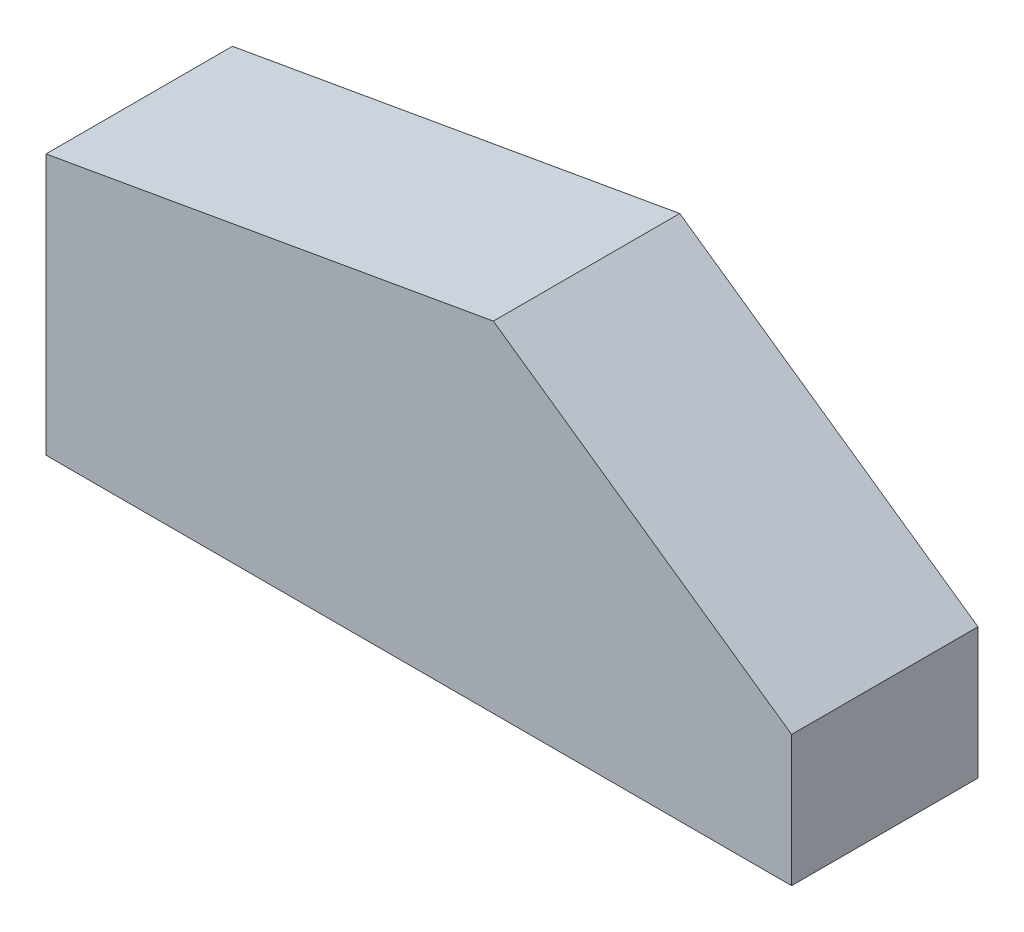
ISO-10303-21;
HEADER;
FILE_DESCRIPTION(('STEP AP214'),'2;1');
FILE_NAME('part.step','',(''),(''),'','','');
FILE_SCHEMA(('AUTOMOTIVE_DESIGN { 1 0 10303 214 1 1 1 1 }'));
ENDSEC;
DATA;
#1=APPLICATION_CONTEXT('core data for automotive mechanical design processes');
#2=APPLICATION_PROTOCOL_DEFINITION('international standard','automotive_design',2000,#1);
#3=PRODUCT_CONTEXT('',#1,'mechanical');
#4=PRODUCT('Part','Part','',(#3));
#5=PRODUCT_RELATED_PRODUCT_CATEGORY('part','',(#4));
#6=PRODUCT_DEFINITION_FORMATION('','',#4);
#7=PRODUCT_DEFINITION_CONTEXT('part definition',#1,'design');
#8=PRODUCT_DEFINITION('design','',#6,#7);
#9=PRODUCT_DEFINITION_SHAPE('','',#8);
#10=(LENGTH_UNIT() NAMED_UNIT(*) SI_UNIT(.MILLI.,.METRE.));
#11=(NAMED_UNIT(*) PLANE_ANGLE_UNIT() SI_UNIT($,.RADIAN.));
#12=(NAMED_UNIT(*) SI_UNIT($,.STERADIAN.) SOLID_ANGLE_UNIT());
#13=UNCERTAINTY_MEASURE_WITH_UNIT(LENGTH_MEASURE(1.E-05),#10,'distance_accuracy_value','');
#14=(GEOMETRIC_REPRESENTATION_CONTEXT(3) GLOBAL_UNCERTAINTY_ASSIGNED_CONTEXT((#13)) GLOBAL_UNIT_ASSIGNED_CONTEXT((#10,
#11,#12)) REPRESENTATION_CONTEXT('',''));
#15=CARTESIAN_POINT('',(0.,0.,0.));
#16=DIRECTION('',(0.,0.,1.));
#17=DIRECTION('',(1.,0.,0.));
#18=AXIS2_PLACEMENT_3D('',#15,#16,#17);
#19=CARTESIAN_POINT('',(75.,112.57131731412,25.));
#20=DIRECTION('',(-0.573576436351044,-0.819152044288993,0.));
#21=DIRECTION('',(0.819152044288993,-0.573576436351044,0.));
#22=AXIS2_PLACEMENT_3D('',#19,#20,#21);
#23=PLANE('',#22);
#24=DIRECTION('',(-0.819152044288993,0.573576436351044,0.));
#25=VECTOR('',#24,1.);
#26=CARTESIAN_POINT('',(75.,112.57131731412,0.));
#27=LINE('',#26,#25);
#28=CARTESIAN_POINT('',(75.,112.57131731412,0.));
#29=VERTEX_POINT('',#28);
#30=CARTESIAN_POINT('',(35.,140.579618842508,0.));
#31=VERTEX_POINT('',#30);
#32=EDGE_CURVE('E108',#29,#31,#27,.T.);
#33=ORIENTED_EDGE('',*,*,#32,.T.);
#34=DIRECTION('',(0.,0.,-1.));
#35=VECTOR('',#34,1.);
#36=CARTESIAN_POINT('',(35.,140.579618842508,25.));
#37=LINE('',#36,#35);
#38=CARTESIAN_POINT('',(35.,140.579618842508,25.));
#39=VERTEX_POINT('',#38);
#40=EDGE_CURVE('E11',#39,#31,#37,.T.);
#41=ORIENTED_EDGE('',*,*,#40,.F.);
#42=DIRECTION('',(-0.819152044288993,0.573576436351044,0.));
#43=VECTOR('',#42,1.);
#44=CARTESIAN_POINT('',(75.,112.57131731412,25.));
#45=LINE('',#44,#43);
#46=CARTESIAN_POINT('',(75.,112.57131731412,25.));
#47=VERTEX_POINT('',#46);
#48=EDGE_CURVE('E102',#47,#39,#45,.T.);
#49=ORIENTED_EDGE('',*,*,#48,.F.);
#50=DIRECTION('',(0.,0.,-1.));
#51=VECTOR('',#50,1.);
#52=CARTESIAN_POINT('',(75.,112.57131731412,25.));
#53=LINE('',#52,#51);
#54=EDGE_CURVE('E107',#47,#29,#53,.T.);
#55=ORIENTED_EDGE('',*,*,#54,.T.);
#56=EDGE_LOOP('',(#33,#41,#49,#55));
#57=FACE_BOUND('',#56,.T.);
#58=ADVANCED_FACE('F33',(#57),#23,.F.);
#59=CARTESIAN_POINT('',(35.,140.579618842508,25.));
#60=DIRECTION('',(0.173648177666934,-0.984807753012207,0.));
#61=DIRECTION('',(0.984807753012208,0.173648177666934,0.));
#62=AXIS2_PLACEMENT_3D('',#59,#60,#61);
#63=PLANE('',#62);
#64=DIRECTION('',(-0.984807753012207,-0.173648177666934,0.));
#65=VECTOR('',#64,1.);
#66=CARTESIAN_POINT('',(35.,140.579618842508,0.));
#67=LINE('',#66,#65);
#68=CARTESIAN_POINT('',(-25.,130.,0.));
#69=VERTEX_POINT('',#68);
#70=EDGE_CURVE('E111',#31,#69,#67,.T.);
#71=ORIENTED_EDGE('',*,*,#70,.T.);
#72=DIRECTION('',(0.,0.,-1.));
#73=VECTOR('',#72,1.);
#74=CARTESIAN_POINT('',(-25.,130.,25.));
#75=LINE('',#74,#73);
#76=CARTESIAN_POINT('',(-25.,130.,25.));
#77=VERTEX_POINT('',#76);
#78=EDGE_CURVE('E41',#77,#69,#75,.T.);
#79=ORIENTED_EDGE('',*,*,#78,.F.);
#80=DIRECTION('',(-0.984807753012207,-0.173648177666934,0.));
#81=VECTOR('',#80,1.);
#82=CARTESIAN_POINT('',(35.,140.579618842508,25.));
#83=LINE('',#82,#81);
#84=EDGE_CURVE('E82',#39,#77,#83,.T.);
#85=ORIENTED_EDGE('',*,*,#84,.F.);
#86=ORIENTED_EDGE('',*,*,#40,.T.);
#87=EDGE_LOOP('',(#71,#79,#85,#86));
#88=FACE_BOUND('',#87,.T.);
#89=ADVANCED_FACE('F118',(#88),#63,.F.);
#90=CARTESIAN_POINT('',(-25.,95.,25.));
#91=DIRECTION('',(-1.,0.,0.));
#92=DIRECTION('',(0.,-1.,0.));
#93=AXIS2_PLACEMENT_3D('',#90,#91,#92);
#94=PLANE('',#93);
#95=DIRECTION('',(0.,1.,0.));
#96=VECTOR('',#95,1.);
#97=CARTESIAN_POINT('',(-25.,95.,0.));
#98=LINE('',#97,#96);
#99=CARTESIAN_POINT('',(-25.,95.,0.));
#100=VERTEX_POINT('',#99);
#101=EDGE_CURVE('E94',#100,#69,#98,.T.);
#102=ORIENTED_EDGE('',*,*,#101,.F.);
#103=DIRECTION('',(0.,0.,-1.));
#104=VECTOR('',#103,1.);
#105=CARTESIAN_POINT('',(-25.,95.,25.));
#106=LINE('',#105,#104);
#107=CARTESIAN_POINT('',(-25.,95.,25.));
#108=VERTEX_POINT('',#107);
#109=EDGE_CURVE('E88',#108,#100,#106,.T.);
#110=ORIENTED_EDGE('',*,*,#109,.F.);
#111=DIRECTION('',(0.,1.,0.));
#112=VECTOR('',#111,1.);
#113=CARTESIAN_POINT('',(-25.,95.,25.));
#114=LINE('',#113,#112);
#115=EDGE_CURVE('E92',#108,#77,#114,.T.);
#116=ORIENTED_EDGE('',*,*,#115,.T.);
#117=ORIENTED_EDGE('',*,*,#78,.T.);
#118=EDGE_LOOP('',(#102,#110,#116,#117));
#119=FACE_BOUND('',#118,.T.);
#120=ADVANCED_FACE('F90',(#119),#94,.T.);
#121=CARTESIAN_POINT('',(-25.,95.,25.));
#122=DIRECTION('',(0.,1.,0.));
#123=DIRECTION('',(0.,0.,1.));
#124=AXIS2_PLACEMENT_3D('',#121,#122,#123);
#125=PLANE('',#124);
#126=DIRECTION('',(1.,0.,0.));
#127=VECTOR('',#126,1.);
#128=CARTESIAN_POINT('',(-25.,95.,0.));
#129=LINE('',#128,#127);
#130=CARTESIAN_POINT('',(75.,95.,0.));
#131=VERTEX_POINT('',#130);
#132=EDGE_CURVE('E68',#100,#131,#129,.T.);
#133=ORIENTED_EDGE('',*,*,#132,.T.);
#134=DIRECTION('',(0.,0.,-1.));
#135=VECTOR('',#134,1.);
#136=CARTESIAN_POINT('',(75.,95.,25.));
#137=LINE('',#136,#135);
#138=CARTESIAN_POINT('',(75.,95.,25.));
#139=VERTEX_POINT('',#138);
#140=EDGE_CURVE('E95',#139,#131,#137,.T.);
#141=ORIENTED_EDGE('',*,*,#140,.F.);
#142=DIRECTION('',(1.,0.,0.));
#143=VECTOR('',#142,1.);
#144=CARTESIAN_POINT('',(-25.,95.,25.));
#145=LINE('',#144,#143);
#146=EDGE_CURVE('E97',#108,#139,#145,.T.);
#147=ORIENTED_EDGE('',*,*,#146,.F.);
#148=ORIENTED_EDGE('',*,*,#109,.T.);
#149=EDGE_LOOP('',(#133,#141,#147,#148));
#150=FACE_BOUND('',#149,.T.);
#151=ADVANCED_FACE('F98',(#150),#125,.F.);
#152=CARTESIAN_POINT('',(75.,95.,25.));
#153=DIRECTION('',(-1.,0.,0.));
#154=DIRECTION('',(0.,0.,1.));
#155=AXIS2_PLACEMENT_3D('',#152,#153,#154);
#156=PLANE('',#155);
#157=DIRECTION('',(0.,1.,0.));
#158=VECTOR('',#157,1.);
#159=CARTESIAN_POINT('',(75.,95.,0.));
#160=LINE('',#159,#158);
#161=EDGE_CURVE('E74',#131,#29,#160,.T.);
#162=ORIENTED_EDGE('',*,*,#161,.T.);
#163=ORIENTED_EDGE('',*,*,#54,.F.);
#164=DIRECTION('',(0.,1.,0.));
#165=VECTOR('',#164,1.);
#166=CARTESIAN_POINT('',(75.,95.,25.));
#167=LINE('',#166,#165);
#168=EDGE_CURVE('E49',#139,#47,#167,.T.);
#169=ORIENTED_EDGE('',*,*,#168,.F.);
#170=ORIENTED_EDGE('',*,*,#140,.T.);
#171=EDGE_LOOP('',(#162,#163,#169,#170));
#172=FACE_BOUND('',#171,.T.);
#173=ADVANCED_FACE('F125',(#172),#156,.F.);
#174=CARTESIAN_POINT('',(0.,0.,25.));
#175=DIRECTION('',(0.,0.,-1.));
#176=DIRECTION('',(-1.,0.,0.));
#177=AXIS2_PLACEMENT_3D('',#174,#175,#176);
#178=PLANE('',#177);
#179=ORIENTED_EDGE('',*,*,#48,.T.);
#180=ORIENTED_EDGE('',*,*,#84,.T.);
#181=ORIENTED_EDGE('',*,*,#115,.F.);
#182=ORIENTED_EDGE('',*,*,#146,.T.);
#183=ORIENTED_EDGE('',*,*,#168,.T.);
#184=EDGE_LOOP('',(#179,#180,#181,#182,#183));
#185=FACE_BOUND('',#184,.T.);
#186=ADVANCED_FACE('F100',(#185),#178,.F.);
#187=CARTESIAN_POINT('',(0.,0.,0.));
#188=DIRECTION('',(0.,0.,-1.));
#189=DIRECTION('',(-1.,0.,0.));
#190=AXIS2_PLACEMENT_3D('',#187,#188,#189);
#191=PLANE('',#190);
#192=ORIENTED_EDGE('',*,*,#32,.F.);
#193=ORIENTED_EDGE('',*,*,#161,.F.);
#194=ORIENTED_EDGE('',*,*,#132,.F.);
#195=ORIENTED_EDGE('',*,*,#101,.T.);
#196=ORIENTED_EDGE('',*,*,#70,.F.);
#197=EDGE_LOOP('',(#192,#193,#194,#195,#196));
#198=FACE_BOUND('',#197,.T.);
#199=ADVANCED_FACE('F122',(#198),#191,.T.);
#200=CLOSED_SHELL('',(#58,#89,#120,#151,#173,#186,#199));
#201=MANIFOLD_SOLID_BREP('B2',#200);
#202=ADVANCED_BREP_SHAPE_REPRESENTATION('',(#18,#201),#14);
#203=SHAPE_DEFINITION_REPRESENTATION(#9,#202);
ENDSEC;
END-ISO-10303-21;
